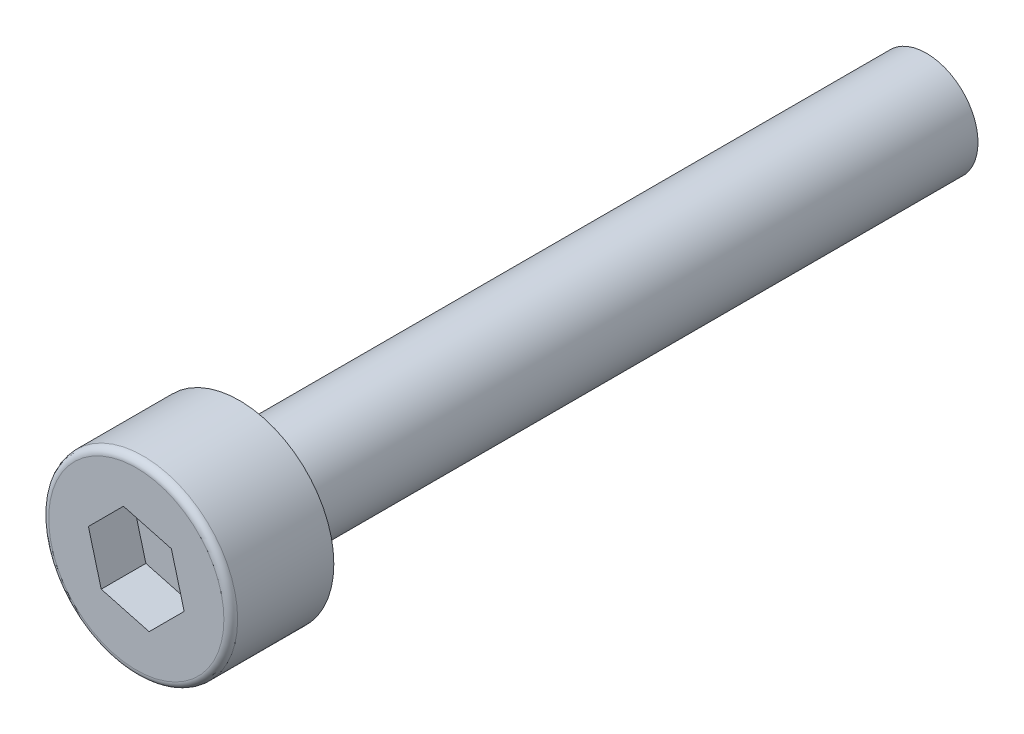
ISO-10303-21;
HEADER;
FILE_DESCRIPTION(('STEP AP214'),'2;1');
FILE_NAME('part.step','',(''),(''),'','','');
FILE_SCHEMA(('AUTOMOTIVE_DESIGN { 1 0 10303 214 1 1 1 1 }'));
ENDSEC;
DATA;
#1=APPLICATION_CONTEXT('core data for automotive mechanical design processes');
#2=APPLICATION_PROTOCOL_DEFINITION('international standard','automotive_design',2000,#1);
#3=PRODUCT_CONTEXT('',#1,'mechanical');
#4=PRODUCT('Part','Part','',(#3));
#5=PRODUCT_RELATED_PRODUCT_CATEGORY('part','',(#4));
#6=PRODUCT_DEFINITION_FORMATION('','',#4);
#7=PRODUCT_DEFINITION_CONTEXT('part definition',#1,'design');
#8=PRODUCT_DEFINITION('design','',#6,#7);
#9=PRODUCT_DEFINITION_SHAPE('','',#8);
#10=(LENGTH_UNIT() NAMED_UNIT(*) SI_UNIT(.MILLI.,.METRE.));
#11=(NAMED_UNIT(*) PLANE_ANGLE_UNIT() SI_UNIT($,.RADIAN.));
#12=(NAMED_UNIT(*) SI_UNIT($,.STERADIAN.) SOLID_ANGLE_UNIT());
#13=UNCERTAINTY_MEASURE_WITH_UNIT(LENGTH_MEASURE(1.E-05),#10,'distance_accuracy_value','');
#14=(GEOMETRIC_REPRESENTATION_CONTEXT(3) GLOBAL_UNCERTAINTY_ASSIGNED_CONTEXT((#13)) GLOBAL_UNIT_ASSIGNED_CONTEXT((#10,
#11,#12)) REPRESENTATION_CONTEXT('',''));
#15=CARTESIAN_POINT('',(0.,0.,0.));
#16=DIRECTION('',(0.,0.,1.));
#17=DIRECTION('',(1.,0.,0.));
#18=AXIS2_PLACEMENT_3D('',#15,#16,#17);
#19=CARTESIAN_POINT('',(0.,0.,0.));
#20=DIRECTION('',(0.,0.,1.));
#21=DIRECTION('',(1.,0.,0.));
#22=AXIS2_PLACEMENT_3D('',#19,#20,#21);
#23=PLANE('',#22);
#24=CARTESIAN_POINT('',(0.,0.,0.));
#25=DIRECTION('',(0.,0.,1.));
#26=DIRECTION('',(1.,0.,0.));
#27=AXIS2_PLACEMENT_3D('',#24,#25,#26);
#28=CIRCLE('',#27,2.75);
#29=CARTESIAN_POINT('',(2.75,0.,0.));
#30=VERTEX_POINT('',#29);
#31=EDGE_CURVE('E137',#30,#30,#28,.T.);
#32=ORIENTED_EDGE('',*,*,#31,.F.);
#33=EDGE_LOOP('',(#32));
#34=FACE_BOUND('',#33,.T.);
#35=CARTESIAN_POINT('',(0.,0.,0.));
#36=DIRECTION('',(0.,0.,1.));
#37=DIRECTION('',(1.,0.,0.));
#38=AXIS2_PLACEMENT_3D('',#35,#36,#37);
#39=CIRCLE('',#38,1.5);
#40=CARTESIAN_POINT('',(1.5,0.,0.));
#41=VERTEX_POINT('',#40);
#42=EDGE_CURVE('E145',#41,#41,#39,.F.);
#43=ORIENTED_EDGE('',*,*,#42,.F.);
#44=EDGE_LOOP('',(#43));
#45=FACE_BOUND('',#44,.T.);
#46=ADVANCED_FACE('F34',(#34,#45),#23,.F.);
#47=CARTESIAN_POINT('',(0.,0.,3.));
#48=DIRECTION('',(0.,0.,-1.));
#49=DIRECTION('',(-1.,0.,0.));
#50=AXIS2_PLACEMENT_3D('',#47,#48,#49);
#51=CYLINDRICAL_SURFACE('',#50,2.75);
#52=CARTESIAN_POINT('',(0.,0.,2.8));
#53=DIRECTION('',(0.,0.,1.));
#54=DIRECTION('',(1.,0.,0.));
#55=AXIS2_PLACEMENT_3D('',#52,#53,#54);
#56=CIRCLE('',#55,2.75);
#57=CARTESIAN_POINT('',(2.75,0.,2.8));
#58=VERTEX_POINT('',#57);
#59=EDGE_CURVE('E11',#58,#58,#56,.F.);
#60=ORIENTED_EDGE('',*,*,#59,.T.);
#61=EDGE_LOOP('',(#60));
#62=FACE_BOUND('',#61,.T.);
#63=ORIENTED_EDGE('',*,*,#31,.T.);
#64=EDGE_LOOP('',(#63));
#65=FACE_BOUND('',#64,.T.);
#66=ADVANCED_FACE('F164',(#62,#65),#51,.T.);
#67=CARTESIAN_POINT('',(0.,0.,3.));
#68=DIRECTION('',(0.,0.,1.));
#69=DIRECTION('',(1.,0.,0.));
#70=AXIS2_PLACEMENT_3D('',#67,#68,#69);
#71=PLANE('',#70);
#72=CARTESIAN_POINT('',(0.,0.,3.));
#73=DIRECTION('',(0.,0.,1.));
#74=DIRECTION('',(1.,0.,0.));
#75=AXIS2_PLACEMENT_3D('',#72,#73,#74);
#76=CIRCLE('',#75,2.55);
#77=CARTESIAN_POINT('',(2.55,0.,3.));
#78=VERTEX_POINT('',#77);
#79=EDGE_CURVE('E42',#78,#78,#76,.T.);
#80=ORIENTED_EDGE('',*,*,#79,.T.);
#81=EDGE_LOOP('',(#80));
#82=FACE_BOUND('',#81,.T.);
#83=DIRECTION('',(0.258819045102521,-0.965925826289068,0.));
#84=VECTOR('',#83,1.);
#85=CARTESIAN_POINT('',(-1.39419383956301,0.373573113403356,3.));
#86=LINE('',#85,#84);
#87=CARTESIAN_POINT('',(-1.39419383956301,0.373573113403356,3.));
#88=VERTEX_POINT('',#87);
#89=CARTESIAN_POINT('',(-1.02062072615966,-1.02062072615966,3.));
#90=VERTEX_POINT('',#89);
#91=EDGE_CURVE('E49',#88,#90,#86,.T.);
#92=ORIENTED_EDGE('',*,*,#91,.F.);
#93=DIRECTION('',(-0.707106781186548,-0.707106781186548,0.));
#94=VECTOR('',#93,1.);
#95=CARTESIAN_POINT('',(-0.373573113403355,1.39419383956301,3.));
#96=LINE('',#95,#94);
#97=CARTESIAN_POINT('',(-0.373573113403355,1.39419383956301,3.));
#98=VERTEX_POINT('',#97);
#99=EDGE_CURVE('E133',#98,#88,#96,.T.);
#100=ORIENTED_EDGE('',*,*,#99,.F.);
#101=DIRECTION('',(-0.965925826289068,0.258819045102521,0.));
#102=VECTOR('',#101,1.);
#103=CARTESIAN_POINT('',(1.02062072615966,1.02062072615966,3.));
#104=LINE('',#103,#102);
#105=CARTESIAN_POINT('',(1.02062072615966,1.02062072615966,3.));
#106=VERTEX_POINT('',#105);
#107=EDGE_CURVE('E131',#106,#98,#104,.T.);
#108=ORIENTED_EDGE('',*,*,#107,.F.);
#109=DIRECTION('',(-0.258819045102521,0.965925826289068,0.));
#110=VECTOR('',#109,1.);
#111=CARTESIAN_POINT('',(1.39419383956301,-0.373573113403355,3.));
#112=LINE('',#111,#110);
#113=CARTESIAN_POINT('',(1.39419383956301,-0.373573113403355,3.));
#114=VERTEX_POINT('',#113);
#115=EDGE_CURVE('E97',#114,#106,#112,.T.);
#116=ORIENTED_EDGE('',*,*,#115,.F.);
#117=DIRECTION('',(0.707106781186548,0.707106781186548,0.));
#118=VECTOR('',#117,1.);
#119=CARTESIAN_POINT('',(0.373573113403355,-1.39419383956301,3.));
#120=LINE('',#119,#118);
#121=CARTESIAN_POINT('',(0.373573113403355,-1.39419383956301,3.));
#122=VERTEX_POINT('',#121);
#123=EDGE_CURVE('E127',#122,#114,#120,.T.);
#124=ORIENTED_EDGE('',*,*,#123,.F.);
#125=DIRECTION('',(0.965925826289068,-0.258819045102521,0.));
#126=VECTOR('',#125,1.);
#127=CARTESIAN_POINT('',(-1.02062072615966,-1.02062072615966,3.));
#128=LINE('',#127,#126);
#129=EDGE_CURVE('E123',#90,#122,#128,.T.);
#130=ORIENTED_EDGE('',*,*,#129,.F.);
#131=EDGE_LOOP('',(#92,#100,#108,#116,#124,#130));
#132=FACE_BOUND('',#131,.T.);
#133=ADVANCED_FACE('F150',(#82,#132),#71,.T.);
#134=CARTESIAN_POINT('',(-1.39419383956301,0.373573113403356,1.7));
#135=DIRECTION('',(-0.965925826289068,-0.258819045102521,0.));
#136=DIRECTION('',(0.258819045102521,-0.965925826289068,0.));
#137=AXIS2_PLACEMENT_3D('',#134,#135,#136);
#138=PLANE('',#137);
#139=ORIENTED_EDGE('',*,*,#91,.T.);
#140=DIRECTION('',(0.,0.,1.));
#141=VECTOR('',#140,1.);
#142=CARTESIAN_POINT('',(-1.02062072615966,-1.02062072615966,1.7));
#143=LINE('',#142,#141);
#144=CARTESIAN_POINT('',(-1.02062072615966,-1.02062072615966,1.7));
#145=VERTEX_POINT('',#144);
#146=EDGE_CURVE('E79',#145,#90,#143,.T.);
#147=ORIENTED_EDGE('',*,*,#146,.F.);
#148=DIRECTION('',(0.258819045102521,-0.965925826289068,0.));
#149=VECTOR('',#148,1.);
#150=CARTESIAN_POINT('',(-1.39419383956301,0.373573113403356,1.7));
#151=LINE('',#150,#149);
#152=CARTESIAN_POINT('',(-1.39419383956301,0.373573113403356,1.7));
#153=VERTEX_POINT('',#152);
#154=EDGE_CURVE('E135',#153,#145,#151,.T.);
#155=ORIENTED_EDGE('',*,*,#154,.F.);
#156=DIRECTION('',(0.,0.,1.));
#157=VECTOR('',#156,1.);
#158=CARTESIAN_POINT('',(-1.39419383956301,0.373573113403356,1.7));
#159=LINE('',#158,#157);
#160=EDGE_CURVE('E57',#153,#88,#159,.T.);
#161=ORIENTED_EDGE('',*,*,#160,.T.);
#162=EDGE_LOOP('',(#139,#147,#155,#161));
#163=FACE_BOUND('',#162,.T.);
#164=ADVANCED_FACE('F176',(#163),#138,.F.);
#165=CARTESIAN_POINT('',(-0.373573113403355,1.39419383956301,1.7));
#166=DIRECTION('',(-0.707106781186548,0.707106781186548,0.));
#167=DIRECTION('',(-0.707106781186548,-0.707106781186548,0.));
#168=AXIS2_PLACEMENT_3D('',#165,#166,#167);
#169=PLANE('',#168);
#170=ORIENTED_EDGE('',*,*,#99,.T.);
#171=ORIENTED_EDGE('',*,*,#160,.F.);
#172=DIRECTION('',(-0.707106781186548,-0.707106781186548,0.));
#173=VECTOR('',#172,1.);
#174=CARTESIAN_POINT('',(-0.373573113403355,1.39419383956301,1.7));
#175=LINE('',#174,#173);
#176=CARTESIAN_POINT('',(-0.373573113403355,1.39419383956301,1.7));
#177=VERTEX_POINT('',#176);
#178=EDGE_CURVE('E109',#177,#153,#175,.T.);
#179=ORIENTED_EDGE('',*,*,#178,.F.);
#180=DIRECTION('',(0.,0.,1.));
#181=VECTOR('',#180,1.);
#182=CARTESIAN_POINT('',(-0.373573113403355,1.39419383956301,1.7));
#183=LINE('',#182,#181);
#184=EDGE_CURVE('E101',#177,#98,#183,.T.);
#185=ORIENTED_EDGE('',*,*,#184,.T.);
#186=EDGE_LOOP('',(#170,#171,#179,#185));
#187=FACE_BOUND('',#186,.T.);
#188=ADVANCED_FACE('F179',(#187),#169,.F.);
#189=CARTESIAN_POINT('',(1.02062072615966,1.02062072615966,1.7));
#190=DIRECTION('',(0.258819045102521,0.965925826289068,0.));
#191=DIRECTION('',(-0.965925826289068,0.258819045102521,0.));
#192=AXIS2_PLACEMENT_3D('',#189,#190,#191);
#193=PLANE('',#192);
#194=ORIENTED_EDGE('',*,*,#107,.T.);
#195=ORIENTED_EDGE('',*,*,#184,.F.);
#196=DIRECTION('',(-0.965925826289068,0.258819045102521,0.));
#197=VECTOR('',#196,1.);
#198=CARTESIAN_POINT('',(1.02062072615966,1.02062072615966,1.7));
#199=LINE('',#198,#197);
#200=CARTESIAN_POINT('',(1.02062072615966,1.02062072615966,1.7));
#201=VERTEX_POINT('',#200);
#202=EDGE_CURVE('E105',#201,#177,#199,.T.);
#203=ORIENTED_EDGE('',*,*,#202,.F.);
#204=DIRECTION('',(0.,0.,1.));
#205=VECTOR('',#204,1.);
#206=CARTESIAN_POINT('',(1.02062072615966,1.02062072615966,1.7));
#207=LINE('',#206,#205);
#208=EDGE_CURVE('E90',#201,#106,#207,.T.);
#209=ORIENTED_EDGE('',*,*,#208,.T.);
#210=EDGE_LOOP('',(#194,#195,#203,#209));
#211=FACE_BOUND('',#210,.T.);
#212=ADVANCED_FACE('F106',(#211),#193,.F.);
#213=CARTESIAN_POINT('',(1.39419383956301,-0.373573113403355,1.7));
#214=DIRECTION('',(0.965925826289068,0.258819045102521,0.));
#215=DIRECTION('',(-0.258819045102521,0.965925826289068,0.));
#216=AXIS2_PLACEMENT_3D('',#213,#214,#215);
#217=PLANE('',#216);
#218=ORIENTED_EDGE('',*,*,#115,.T.);
#219=ORIENTED_EDGE('',*,*,#208,.F.);
#220=DIRECTION('',(-0.258819045102521,0.965925826289068,0.));
#221=VECTOR('',#220,1.);
#222=CARTESIAN_POINT('',(1.39419383956301,-0.373573113403355,1.7));
#223=LINE('',#222,#221);
#224=CARTESIAN_POINT('',(1.39419383956301,-0.373573113403355,1.7));
#225=VERTEX_POINT('',#224);
#226=EDGE_CURVE('E94',#225,#201,#223,.T.);
#227=ORIENTED_EDGE('',*,*,#226,.F.);
#228=DIRECTION('',(0.,0.,1.));
#229=VECTOR('',#228,1.);
#230=CARTESIAN_POINT('',(1.39419383956301,-0.373573113403355,1.7));
#231=LINE('',#230,#229);
#232=EDGE_CURVE('E102',#225,#114,#231,.T.);
#233=ORIENTED_EDGE('',*,*,#232,.T.);
#234=EDGE_LOOP('',(#218,#219,#227,#233));
#235=FACE_BOUND('',#234,.T.);
#236=ADVANCED_FACE('F92',(#235),#217,.F.);
#237=CARTESIAN_POINT('',(0.373573113403355,-1.39419383956301,1.7));
#238=DIRECTION('',(0.707106781186548,-0.707106781186548,0.));
#239=DIRECTION('',(0.707106781186548,0.707106781186548,0.));
#240=AXIS2_PLACEMENT_3D('',#237,#238,#239);
#241=PLANE('',#240);
#242=ORIENTED_EDGE('',*,*,#123,.T.);
#243=ORIENTED_EDGE('',*,*,#232,.F.);
#244=DIRECTION('',(0.707106781186548,0.707106781186548,0.));
#245=VECTOR('',#244,1.);
#246=CARTESIAN_POINT('',(0.373573113403355,-1.39419383956301,1.7));
#247=LINE('',#246,#245);
#248=CARTESIAN_POINT('',(0.373573113403355,-1.39419383956301,1.7));
#249=VERTEX_POINT('',#248);
#250=EDGE_CURVE('E115',#249,#225,#247,.T.);
#251=ORIENTED_EDGE('',*,*,#250,.F.);
#252=DIRECTION('',(0.,0.,1.));
#253=VECTOR('',#252,1.);
#254=CARTESIAN_POINT('',(0.373573113403355,-1.39419383956301,1.7));
#255=LINE('',#254,#253);
#256=EDGE_CURVE('E140',#249,#122,#255,.T.);
#257=ORIENTED_EDGE('',*,*,#256,.T.);
#258=EDGE_LOOP('',(#242,#243,#251,#257));
#259=FACE_BOUND('',#258,.T.);
#260=ADVANCED_FACE('F183',(#259),#241,.F.);
#261=CARTESIAN_POINT('',(-1.02062072615966,-1.02062072615966,1.7));
#262=DIRECTION('',(-0.258819045102521,-0.965925826289068,0.));
#263=DIRECTION('',(0.965925826289068,-0.258819045102521,0.));
#264=AXIS2_PLACEMENT_3D('',#261,#262,#263);
#265=PLANE('',#264);
#266=ORIENTED_EDGE('',*,*,#129,.T.);
#267=ORIENTED_EDGE('',*,*,#256,.F.);
#268=DIRECTION('',(0.965925826289068,-0.258819045102521,0.));
#269=VECTOR('',#268,1.);
#270=CARTESIAN_POINT('',(-1.02062072615966,-1.02062072615966,1.7));
#271=LINE('',#270,#269);
#272=EDGE_CURVE('E117',#145,#249,#271,.T.);
#273=ORIENTED_EDGE('',*,*,#272,.F.);
#274=ORIENTED_EDGE('',*,*,#146,.T.);
#275=EDGE_LOOP('',(#266,#267,#273,#274));
#276=FACE_BOUND('',#275,.T.);
#277=ADVANCED_FACE('F180',(#276),#265,.F.);
#278=CARTESIAN_POINT('',(0.,0.,1.7));
#279=DIRECTION('',(0.,0.,1.));
#280=DIRECTION('',(1.,0.,0.));
#281=AXIS2_PLACEMENT_3D('',#278,#279,#280);
#282=PLANE('',#281);
#283=ORIENTED_EDGE('',*,*,#154,.T.);
#284=ORIENTED_EDGE('',*,*,#272,.T.);
#285=ORIENTED_EDGE('',*,*,#250,.T.);
#286=ORIENTED_EDGE('',*,*,#226,.T.);
#287=ORIENTED_EDGE('',*,*,#202,.T.);
#288=ORIENTED_EDGE('',*,*,#178,.T.);
#289=EDGE_LOOP('',(#283,#284,#285,#286,#287,#288));
#290=FACE_BOUND('',#289,.T.);
#291=ADVANCED_FACE('F112',(#290),#282,.T.);
#292=CARTESIAN_POINT('',(0.,0.,-20.));
#293=DIRECTION('',(0.,0.,1.));
#294=DIRECTION('',(1.,0.,0.));
#295=AXIS2_PLACEMENT_3D('',#292,#293,#294);
#296=CYLINDRICAL_SURFACE('',#295,1.5);
#297=CARTESIAN_POINT('',(0.,0.,-20.));
#298=DIRECTION('',(0.,0.,-1.));
#299=DIRECTION('',(-1.,0.,0.));
#300=AXIS2_PLACEMENT_3D('',#297,#298,#299);
#301=CIRCLE('',#300,1.5);
#302=CARTESIAN_POINT('',(-1.5,0.,-20.));
#303=VERTEX_POINT('',#302);
#304=EDGE_CURVE('E124',#303,#303,#301,.T.);
#305=ORIENTED_EDGE('',*,*,#304,.F.);
#306=EDGE_LOOP('',(#305));
#307=FACE_BOUND('',#306,.T.);
#308=ORIENTED_EDGE('',*,*,#42,.T.);
#309=EDGE_LOOP('',(#308));
#310=FACE_BOUND('',#309,.T.);
#311=ADVANCED_FACE('F159',(#307,#310),#296,.T.);
#312=CARTESIAN_POINT('',(0.,0.,-20.));
#313=DIRECTION('',(0.,0.,-1.));
#314=DIRECTION('',(-1.,0.,0.));
#315=AXIS2_PLACEMENT_3D('',#312,#313,#314);
#316=PLANE('',#315);
#317=ORIENTED_EDGE('',*,*,#304,.T.);
#318=EDGE_LOOP('',(#317));
#319=FACE_BOUND('',#318,.T.);
#320=ADVANCED_FACE('F154',(#319),#316,.T.);
#321=CARTESIAN_POINT('',(0.,0.,2.8));
#322=DIRECTION('',(0.,0.,1.));
#323=DIRECTION('',(1.,0.,0.));
#324=AXIS2_PLACEMENT_3D('',#321,#322,#323);
#325=TOROIDAL_SURFACE('',#324,2.55,0.2);
#326=ORIENTED_EDGE('',*,*,#59,.F.);
#327=EDGE_LOOP('',(#326));
#328=FACE_BOUND('',#327,.T.);
#329=ORIENTED_EDGE('',*,*,#79,.F.);
#330=EDGE_LOOP('',(#329));
#331=FACE_BOUND('',#330,.T.);
#332=ADVANCED_FACE('F36',(#328,#331),#325,.T.);
#333=CLOSED_SHELL('',(#46,#66,#133,#164,#188,#212,#236,#260,#277,#291,#311,#320,#332));
#334=MANIFOLD_SOLID_BREP('B2',#333);
#335=ADVANCED_BREP_SHAPE_REPRESENTATION('',(#18,#334),#14);
#336=SHAPE_DEFINITION_REPRESENTATION(#9,#335);
ENDSEC;
END-ISO-10303-21;
